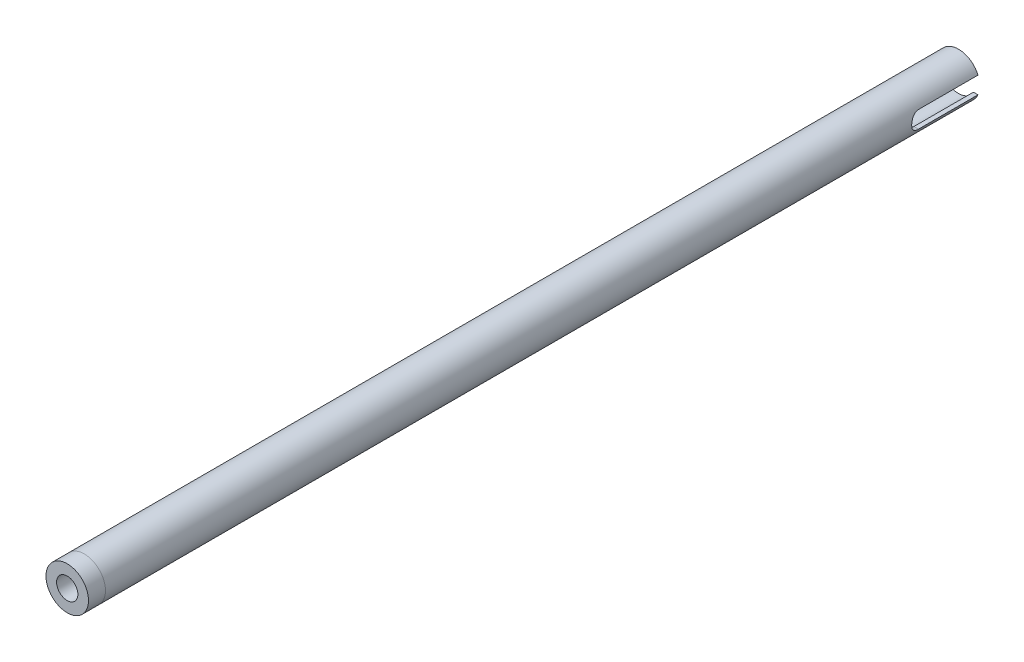
ISO-10303-21;
HEADER;
FILE_DESCRIPTION(('STEP AP214'),'2;1');
FILE_NAME('part.step','',(''),(''),'','','');
FILE_SCHEMA(('AUTOMOTIVE_DESIGN { 1 0 10303 214 1 1 1 1 }'));
ENDSEC;
DATA;
#1=APPLICATION_CONTEXT('core data for automotive mechanical design processes');
#2=APPLICATION_PROTOCOL_DEFINITION('international standard','automotive_design',2000,#1);
#3=PRODUCT_CONTEXT('',#1,'mechanical');
#4=PRODUCT('Part','Part','',(#3));
#5=PRODUCT_RELATED_PRODUCT_CATEGORY('part','',(#4));
#6=PRODUCT_DEFINITION_FORMATION('','',#4);
#7=PRODUCT_DEFINITION_CONTEXT('part definition',#1,'design');
#8=PRODUCT_DEFINITION('design','',#6,#7);
#9=PRODUCT_DEFINITION_SHAPE('','',#8);
#10=(LENGTH_UNIT() NAMED_UNIT(*) SI_UNIT(.MILLI.,.METRE.));
#11=(NAMED_UNIT(*) PLANE_ANGLE_UNIT() SI_UNIT($,.RADIAN.));
#12=(NAMED_UNIT(*) SI_UNIT($,.STERADIAN.) SOLID_ANGLE_UNIT());
#13=UNCERTAINTY_MEASURE_WITH_UNIT(LENGTH_MEASURE(1.E-05),#10,'distance_accuracy_value','');
#14=(GEOMETRIC_REPRESENTATION_CONTEXT(3) GLOBAL_UNCERTAINTY_ASSIGNED_CONTEXT((#13)) GLOBAL_UNIT_ASSIGNED_CONTEXT((#10,
#11,#12)) REPRESENTATION_CONTEXT('',''));
#15=CARTESIAN_POINT('',(0.,0.,0.));
#16=DIRECTION('',(0.,0.,1.));
#17=DIRECTION('',(1.,0.,0.));
#18=AXIS2_PLACEMENT_3D('',#15,#16,#17);
#19=CARTESIAN_POINT('',(0.,0.,-332.656225434528));
#20=DIRECTION('',(0.,0.,1.));
#21=DIRECTION('',(1.,0.,0.));
#22=AXIS2_PLACEMENT_3D('',#19,#20,#21);
#23=CYLINDRICAL_SURFACE('',#22,7.9375);
#24=CARTESIAN_POINT('',(0.,0.,-6.35));
#25=DIRECTION('',(0.,0.,1.));
#26=DIRECTION('',(1.,0.,0.));
#27=AXIS2_PLACEMENT_3D('',#24,#25,#26);
#28=CIRCLE('',#27,7.9375);
#29=CARTESIAN_POINT('',(7.9375,0.,-6.35));
#30=VERTEX_POINT('',#29);
#31=EDGE_CURVE('E167',#30,#30,#28,.T.);
#32=ORIENTED_EDGE('',*,*,#31,.F.);
#33=EDGE_LOOP('',(#32));
#34=FACE_BOUND('',#33,.T.);
#35=CARTESIAN_POINT('',(-7.2748389157424,3.175,-310.431225434528));
#36=CARTESIAN_POINT('',(-7.27482137043434,3.17501267173453,-310.345805319045));
#37=CARTESIAN_POINT('',(-7.27634297592672,3.17155313247793,-310.260394789483));
#38=CARTESIAN_POINT('',(-7.28233338484875,3.15778866907725,-310.090262785155));
#39=CARTESIAN_POINT('',(-7.28680106535325,3.14748635311323,-310.005541060296));
#40=CARTESIAN_POINT('',(-7.2985291631267,3.12019002880163,-309.837727360487));
#41=CARTESIAN_POINT('',(-7.30577831906487,3.10322299732752,-309.754630215728));
#42=CARTESIAN_POINT('',(-7.32282161153744,3.06278779397035,-309.590319113702));
#43=CARTESIAN_POINT('',(-7.33261590324725,3.03931922568674,-309.509105271589));
#44=CARTESIAN_POINT('',(-7.36535331460444,2.95952924342962,-309.269280449006));
#45=CARTESIAN_POINT('',(-7.39167595677839,2.89376893609239,-309.114155520202));
#46=CARTESIAN_POINT('',(-7.45033259991547,2.73920602658923,-308.817068093491));
#47=CARTESIAN_POINT('',(-7.48267254395243,2.65038060922872,-308.675118818273));
#48=CARTESIAN_POINT('',(-7.55175295441386,2.44684429809695,-308.400398048754));
#49=CARTESIAN_POINT('',(-7.58863404630154,2.33103943595689,-308.268470664242));
#50=CARTESIAN_POINT('',(-7.66147718953598,2.07914562663536,-308.02530778061));
#51=CARTESIAN_POINT('',(-7.69743902899202,1.94305205135848,-307.914077015682));
#52=CARTESIAN_POINT('',(-7.76611692840651,1.64778282664419,-307.711155816187));
#53=CARTESIAN_POINT('',(-7.79864638434712,1.48790317306356,-307.620421404783));
#54=CARTESIAN_POINT('',(-7.85502980346525,1.15369615984563,-307.467563851366));
#55=CARTESIAN_POINT('',(-7.87889360585224,0.979385463602722,-307.405408238748));
#56=CARTESIAN_POINT('',(-7.91022225039827,0.670405323433354,-307.324896595092));
#57=CARTESIAN_POINT('',(-7.92038443902171,0.537888188660439,-307.299218671683));
#58=CARTESIAN_POINT('',(-7.93061686811603,0.337231082382107,-307.273463588601));
#59=CARTESIAN_POINT('',(-7.93319257341971,0.269991647180298,-307.267005491321));
#60=CARTESIAN_POINT('',(-7.93663621925193,0.135173873369596,-307.258384473569));
#61=CARTESIAN_POINT('',(-7.93750363389236,0.0675954368175869,-307.25622287575));
#62=CARTESIAN_POINT('',(-7.9375,0.,-307.256225434528));
#63=B_SPLINE_CURVE_WITH_KNOTS('',3,(#35,#36,#37,#38,#39,#40,#41,#42,#43,#44,#45,#46,#47,#48,#49,
#50,#51,#52,#53,#54,#55,#56,#57,#58,#59,#60,#61,#62),.UNSPECIFIED.,.F.,.F.,(4,2,2,2,2,2,2,2,2,2,
2,2,2,4),(0.,0.256160797396612,0.512224013007058,0.767261264672238,1.02231406945471,
1.53142416248594,2.04103978047897,2.57679273649398,3.11266809162683,3.66991136029742,
4.22651992730645,4.63134321412666,4.8339937586662,5.03670667834028),.UNSPECIFIED.);
#64=CARTESIAN_POINT('',(-7.2748389157424,3.175,-310.431225434528));
#65=VERTEX_POINT('',#64);
#66=CARTESIAN_POINT('',(-7.9375,0.,-307.256225434528));
#67=VERTEX_POINT('',#66);
#68=EDGE_CURVE('E194',#65,#67,#63,.T.);
#69=ORIENTED_EDGE('',*,*,#68,.T.);
#70=CARTESIAN_POINT('',(-7.9375,0.,-307.256225434528));
#71=CARTESIAN_POINT('',(-7.93751279435796,-0.0856973243893185,-307.256213404359));
#72=CARTESIAN_POINT('',(-7.93611246860092,-0.171386675169291,-307.259694771831));
#73=CARTESIAN_POINT('',(-7.93058107051394,-0.342092796869088,-307.273550867165));
#74=CARTESIAN_POINT('',(-7.92645080745519,-0.427109759557717,-307.283923552148));
#75=CARTESIAN_POINT('',(-7.91557399086504,-0.595570690948319,-307.311420746216));
#76=CARTESIAN_POINT('',(-7.90883664469869,-0.67901912358001,-307.328521497489));
#77=CARTESIAN_POINT('',(-7.89293284658536,-0.844038966454646,-307.369288744962));
#78=CARTESIAN_POINT('',(-7.88376629739099,-0.925610301410303,-307.392955504019));
#79=CARTESIAN_POINT('',(-7.85297007832481,-1.16656173687588,-307.473463159718));
#80=CARTESIAN_POINT('',(-7.82802544143958,-1.32244720282989,-307.539855792595));
#81=CARTESIAN_POINT('',(-7.77174407779742,-1.62081902572888,-307.695901196588));
#82=CARTESIAN_POINT('',(-7.74040257287306,-1.7632952496653,-307.785571368651));
#83=CARTESIAN_POINT('',(-7.67287736621953,-2.03755465224644,-307.990024976166));
#84=CARTESIAN_POINT('',(-7.63654472176442,-2.16862853615059,-308.105711832898));
#85=CARTESIAN_POINT('',(-7.56380976030912,-2.41011022612819,-308.357005934607));
#86=CARTESIAN_POINT('',(-7.52740741976911,-2.52050895891189,-308.492621879089));
#87=CARTESIAN_POINT('',(-7.45683282624284,-2.72240939900242,-308.787320373955));
#88=CARTESIAN_POINT('',(-7.4228346735038,-2.81283701743189,-308.947184363871));
#89=CARTESIAN_POINT('',(-7.3633362219632,-2.96511894168388,-309.281310328667));
#90=CARTESIAN_POINT('',(-7.33782422493328,-3.02701262758154,-309.455552066426));
#91=CARTESIAN_POINT('',(-7.30424985403508,-3.10695047193342,-309.763855791078));
#92=CARTESIAN_POINT('',(-7.29331360019113,-3.13238569878909,-309.895714551964));
#93=CARTESIAN_POINT('',(-7.28227977674291,-3.15790858319001,-310.095431433658));
#94=CARTESIAN_POINT('',(-7.27949685702346,-3.16431127275807,-310.162379724417));
#95=CARTESIAN_POINT('',(-7.27577355567174,-3.17285909036155,-310.296621282284));
#96=CARTESIAN_POINT('',(-7.27483380475762,-3.1750027609968,-310.363914659581));
#97=CARTESIAN_POINT('',(-7.2748389157424,-3.175,-310.431225434528));
#98=B_SPLINE_CURVE_WITH_KNOTS('',3,(#70,#71,#72,#73,#74,#75,#76,#77,#78,#79,#80,#81,#82,#83,#84,
#85,#86,#87,#88,#89,#90,#91,#92,#93,#94,#95,#96,#97),.UNSPECIFIED.,.F.,.F.,(4,2,2,2,2,2,2,2,2,2,
2,2,2,4),(0.,0.256996432008007,0.513916713336978,0.769937797705386,1.02596913282157,
1.53722547809954,2.04886511530059,2.58219314099272,3.11575467201799,3.67332953074261,
4.2301325519037,4.63306130520181,4.8348500382744,5.03670780985612),.UNSPECIFIED.);
#99=CARTESIAN_POINT('',(-7.2748389157424,-3.175,-310.431225434528));
#100=VERTEX_POINT('',#99);
#101=EDGE_CURVE('E146',#67,#100,#98,.T.);
#102=ORIENTED_EDGE('',*,*,#101,.T.);
#103=DIRECTION('',(0.,0.,-1.));
#104=VECTOR('',#103,1.);
#105=CARTESIAN_POINT('',(-7.2748389157424,-3.175,-307.256225434528));
#106=LINE('',#105,#104);
#107=CARTESIAN_POINT('',(-7.2748389157424,-3.175,-332.656225434528));
#108=VERTEX_POINT('',#107);
#109=EDGE_CURVE('E141',#100,#108,#106,.T.);
#110=ORIENTED_EDGE('',*,*,#109,.T.);
#111=CARTESIAN_POINT('',(0.,0.,-332.656225434528));
#112=DIRECTION('',(0.,0.,1.));
#113=DIRECTION('',(1.,0.,0.));
#114=AXIS2_PLACEMENT_3D('',#111,#112,#113);
#115=CIRCLE('',#114,7.9375);
#116=CARTESIAN_POINT('',(7.2748389157424,-3.175,-332.656225434528));
#117=VERTEX_POINT('',#116);
#118=EDGE_CURVE('E144',#108,#117,#115,.T.);
#119=ORIENTED_EDGE('',*,*,#118,.T.);
#120=DIRECTION('',(0.,0.,-1.));
#121=VECTOR('',#120,1.);
#122=CARTESIAN_POINT('',(7.2748389157424,-3.175,-307.256225434528));
#123=LINE('',#122,#121);
#124=CARTESIAN_POINT('',(7.2748389157424,-3.175,-310.431225434528));
#125=VERTEX_POINT('',#124);
#126=EDGE_CURVE('E427',#125,#117,#123,.T.);
#127=ORIENTED_EDGE('',*,*,#126,.F.);
#128=CARTESIAN_POINT('',(7.2748389157424,-3.175,-310.431225434528));
#129=CARTESIAN_POINT('',(7.27482137043434,-3.17501267173453,-310.345805319045));
#130=CARTESIAN_POINT('',(7.27634297592672,-3.17155313247793,-310.260394789483));
#131=CARTESIAN_POINT('',(7.28233338484875,-3.15778866907725,-310.090262785155));
#132=CARTESIAN_POINT('',(7.28680106535325,-3.14748635311323,-310.005541060296));
#133=CARTESIAN_POINT('',(7.2985291631267,-3.12019002880163,-309.837727360487));
#134=CARTESIAN_POINT('',(7.30577831906487,-3.10322299732752,-309.754630215728));
#135=CARTESIAN_POINT('',(7.32282161153744,-3.06278779397035,-309.590319113702));
#136=CARTESIAN_POINT('',(7.33261590324725,-3.03931922568674,-309.509105271589));
#137=CARTESIAN_POINT('',(7.36535331460444,-2.95952924342962,-309.269280449006));
#138=CARTESIAN_POINT('',(7.39167595677839,-2.89376893609239,-309.114155520202));
#139=CARTESIAN_POINT('',(7.45033259991547,-2.73920602658923,-308.817068093491));
#140=CARTESIAN_POINT('',(7.48267254395243,-2.65038060922872,-308.675118818273));
#141=CARTESIAN_POINT('',(7.55175295441386,-2.44684429809695,-308.400398048754));
#142=CARTESIAN_POINT('',(7.58863404630154,-2.33103943595689,-308.268470664242));
#143=CARTESIAN_POINT('',(7.66147718953598,-2.07914562663536,-308.02530778061));
#144=CARTESIAN_POINT('',(7.69743902899202,-1.94305205135848,-307.914077015682));
#145=CARTESIAN_POINT('',(7.76611692840651,-1.64778282664419,-307.711155816187));
#146=CARTESIAN_POINT('',(7.79864638434712,-1.48790317306356,-307.620421404783));
#147=CARTESIAN_POINT('',(7.85502980346525,-1.15369615984563,-307.467563851366));
#148=CARTESIAN_POINT('',(7.87889360585224,-0.979385463602722,-307.405408238748));
#149=CARTESIAN_POINT('',(7.91022225039827,-0.670405323433354,-307.324896595092));
#150=CARTESIAN_POINT('',(7.92038443902171,-0.537888188660439,-307.299218671683));
#151=CARTESIAN_POINT('',(7.93061686811603,-0.337231082382107,-307.273463588601));
#152=CARTESIAN_POINT('',(7.93319257341971,-0.269991647180298,-307.267005491321));
#153=CARTESIAN_POINT('',(7.93663621925193,-0.135173873369596,-307.258384473569));
#154=CARTESIAN_POINT('',(7.93750363389236,-0.0675954368175869,-307.25622287575));
#155=CARTESIAN_POINT('',(7.9375,0.,-307.256225434528));
#156=B_SPLINE_CURVE_WITH_KNOTS('',3,(#128,#129,#130,#131,#132,#133,#134,#135,#136,#137,#138,
#139,#140,#141,#142,#143,#144,#145,#146,#147,#148,#149,#150,#151,#152,#153,#154,#155),
.UNSPECIFIED.,.F.,.F.,(4,2,2,2,2,2,2,2,2,2,2,2,2,4),(0.,0.256160797396612,0.512224013007058,
0.767261264672238,1.02231406945471,1.53142416248594,2.04103978047897,2.57679273649398,
3.11266809162683,3.66991136029742,4.22651992730645,4.63134321412666,4.8339937586662,
5.03670667834028),.UNSPECIFIED.);
#157=CARTESIAN_POINT('',(7.9375,0.,-307.256225434528));
#158=VERTEX_POINT('',#157);
#159=EDGE_CURVE('E87',#125,#158,#156,.T.);
#160=ORIENTED_EDGE('',*,*,#159,.T.);
#161=CARTESIAN_POINT('',(7.9375,0.,-307.256225434528));
#162=CARTESIAN_POINT('',(7.93751279435796,0.0856973243893185,-307.256213404359));
#163=CARTESIAN_POINT('',(7.93611246860092,0.171386675169291,-307.259694771831));
#164=CARTESIAN_POINT('',(7.93058107051394,0.342092796869088,-307.273550867165));
#165=CARTESIAN_POINT('',(7.92645080745519,0.427109759557717,-307.283923552148));
#166=CARTESIAN_POINT('',(7.91557399086504,0.595570690948319,-307.311420746216));
#167=CARTESIAN_POINT('',(7.90883664469869,0.67901912358001,-307.328521497489));
#168=CARTESIAN_POINT('',(7.89293284658536,0.844038966454646,-307.369288744962));
#169=CARTESIAN_POINT('',(7.88376629739099,0.925610301410303,-307.392955504019));
#170=CARTESIAN_POINT('',(7.85297007832481,1.16656173687588,-307.473463159718));
#171=CARTESIAN_POINT('',(7.82802544143958,1.32244720282989,-307.539855792595));
#172=CARTESIAN_POINT('',(7.77174407779742,1.62081902572888,-307.695901196588));
#173=CARTESIAN_POINT('',(7.74040257287306,1.7632952496653,-307.785571368651));
#174=CARTESIAN_POINT('',(7.67287736621953,2.03755465224644,-307.990024976166));
#175=CARTESIAN_POINT('',(7.63654472176442,2.16862853615059,-308.105711832898));
#176=CARTESIAN_POINT('',(7.56380976030912,2.41011022612819,-308.357005934607));
#177=CARTESIAN_POINT('',(7.52740741976911,2.52050895891189,-308.492621879089));
#178=CARTESIAN_POINT('',(7.45683282624284,2.72240939900242,-308.787320373955));
#179=CARTESIAN_POINT('',(7.4228346735038,2.81283701743189,-308.947184363871));
#180=CARTESIAN_POINT('',(7.3633362219632,2.96511894168388,-309.281310328667));
#181=CARTESIAN_POINT('',(7.33782422493328,3.02701262758154,-309.455552066426));
#182=CARTESIAN_POINT('',(7.30424985403508,3.10695047193342,-309.763855791078));
#183=CARTESIAN_POINT('',(7.29331360019113,3.13238569878909,-309.895714551964));
#184=CARTESIAN_POINT('',(7.28227977674291,3.15790858319001,-310.095431433658));
#185=CARTESIAN_POINT('',(7.27949685702346,3.16431127275807,-310.162379724417));
#186=CARTESIAN_POINT('',(7.27577355567174,3.17285909036155,-310.296621282284));
#187=CARTESIAN_POINT('',(7.27483380475762,3.1750027609968,-310.363914659581));
#188=CARTESIAN_POINT('',(7.2748389157424,3.175,-310.431225434528));
#189=B_SPLINE_CURVE_WITH_KNOTS('',3,(#161,#162,#163,#164,#165,#166,#167,#168,#169,#170,#171,
#172,#173,#174,#175,#176,#177,#178,#179,#180,#181,#182,#183,#184,#185,#186,#187,#188),
.UNSPECIFIED.,.F.,.F.,(4,2,2,2,2,2,2,2,2,2,2,2,2,4),(0.,0.256996432008007,0.513916713336978,
0.769937797705386,1.02596913282157,1.53722547809954,2.04886511530059,2.58219314099272,
3.11575467201799,3.67332953074261,4.2301325519037,4.63306130520181,4.8348500382744,
5.03670780985612),.UNSPECIFIED.);
#190=CARTESIAN_POINT('',(7.2748389157424,3.175,-310.431225434528));
#191=VERTEX_POINT('',#190);
#192=EDGE_CURVE('E73',#158,#191,#189,.T.);
#193=ORIENTED_EDGE('',*,*,#192,.T.);
#194=DIRECTION('',(0.,0.,-1.));
#195=VECTOR('',#194,1.);
#196=CARTESIAN_POINT('',(7.2748389157424,3.175,-307.256225434528));
#197=LINE('',#196,#195);
#198=CARTESIAN_POINT('',(7.2748389157424,3.175,-332.656225434528));
#199=VERTEX_POINT('',#198);
#200=EDGE_CURVE('E160',#191,#199,#197,.T.);
#201=ORIENTED_EDGE('',*,*,#200,.T.);
#202=CARTESIAN_POINT('',(-7.2748389157424,3.175,-332.656225434528));
#203=VERTEX_POINT('',#202);
#204=EDGE_CURVE('E166',#199,#203,#115,.T.);
#205=ORIENTED_EDGE('',*,*,#204,.T.);
#206=DIRECTION('',(0.,0.,-1.));
#207=VECTOR('',#206,1.);
#208=CARTESIAN_POINT('',(-7.2748389157424,3.175,-307.256225434528));
#209=LINE('',#208,#207);
#210=EDGE_CURVE('E420',#65,#203,#209,.T.);
#211=ORIENTED_EDGE('',*,*,#210,.F.);
#212=EDGE_LOOP('',(#69,#102,#110,#119,#127,#160,#193,#201,#205,#211));
#213=FACE_BOUND('',#212,.T.);
#214=ADVANCED_FACE('F63',(#34,#213),#23,.T.);
#215=CARTESIAN_POINT('',(0.,0.,-332.656225434528));
#216=DIRECTION('',(0.,0.,1.));
#217=DIRECTION('',(1.,0.,0.));
#218=AXIS2_PLACEMENT_3D('',#215,#216,#217);
#219=PLANE('',#218);
#220=DIRECTION('',(1.,0.,0.));
#221=VECTOR('',#220,1.);
#222=CARTESIAN_POINT('',(0.,-3.175,-332.656225434528));
#223=LINE('',#222,#221);
#224=CARTESIAN_POINT('',(-5.57246419907746,-3.175,-332.656225434528));
#225=VERTEX_POINT('',#224);
#226=EDGE_CURVE('E153',#108,#225,#223,.T.);
#227=ORIENTED_EDGE('',*,*,#226,.T.);
#228=CARTESIAN_POINT('',(0.,0.,-332.656225434528));
#229=DIRECTION('',(0.,0.,1.));
#230=DIRECTION('',(1.,0.,0.));
#231=AXIS2_PLACEMENT_3D('',#228,#229,#230);
#232=CIRCLE('',#231,6.4135);
#233=CARTESIAN_POINT('',(5.57246419907746,-3.175,-332.656225434528));
#234=VERTEX_POINT('',#233);
#235=EDGE_CURVE('E275',#225,#234,#232,.T.);
#236=ORIENTED_EDGE('',*,*,#235,.T.);
#237=DIRECTION('',(1.,0.,0.));
#238=VECTOR('',#237,1.);
#239=CARTESIAN_POINT('',(0.,-3.175,-332.656225434528));
#240=LINE('',#239,#238);
#241=EDGE_CURVE('E165',#234,#117,#240,.T.);
#242=ORIENTED_EDGE('',*,*,#241,.T.);
#243=ORIENTED_EDGE('',*,*,#118,.F.);
#244=EDGE_LOOP('',(#227,#236,#242,#243));
#245=FACE_BOUND('',#244,.T.);
#246=ADVANCED_FACE('F163',(#245),#219,.F.);
#247=CARTESIAN_POINT('',(0.,0.,-332.656225434528));
#248=DIRECTION('',(0.,0.,1.));
#249=DIRECTION('',(1.,0.,0.));
#250=AXIS2_PLACEMENT_3D('',#247,#248,#249);
#251=CYLINDRICAL_SURFACE('',#250,6.4135);
#252=CARTESIAN_POINT('',(0.,0.,-6.35));
#253=DIRECTION('',(0.,0.,1.));
#254=DIRECTION('',(1.,0.,0.));
#255=AXIS2_PLACEMENT_3D('',#252,#253,#254);
#256=CIRCLE('',#255,6.4135);
#257=CARTESIAN_POINT('',(6.4135,0.,-6.35));
#258=VERTEX_POINT('',#257);
#259=EDGE_CURVE('E149',#258,#258,#256,.T.);
#260=ORIENTED_EDGE('',*,*,#259,.T.);
#261=EDGE_LOOP('',(#260));
#262=FACE_BOUND('',#261,.T.);
#263=DIRECTION('',(0.,0.,-1.));
#264=VECTOR('',#263,1.);
#265=CARTESIAN_POINT('',(-5.57246419907746,-3.175,-307.256225434528));
#266=LINE('',#265,#264);
#267=CARTESIAN_POINT('',(-5.57246419907746,-3.175,-310.431225434528));
#268=VERTEX_POINT('',#267);
#269=EDGE_CURVE('E150',#268,#225,#266,.T.);
#270=ORIENTED_EDGE('',*,*,#269,.F.);
#271=CARTESIAN_POINT('',(-5.57246419907746,-3.175,-310.431225434528));
#272=CARTESIAN_POINT('',(-5.57244013006406,-3.17501485930532,-310.347946321489));
#273=CARTESIAN_POINT('',(-5.57433046393327,-3.17172393593588,-310.264680554619));
#274=CARTESIAN_POINT('',(-5.58175879139227,-3.15864741746939,-310.098872969807));
#275=CARTESIAN_POINT('',(-5.58729459414879,-3.14886572313217,-310.016330747206));
#276=CARTESIAN_POINT('',(-5.60179156831922,-3.12299843383605,-309.853033940477));
#277=CARTESIAN_POINT('',(-5.61073298145,-3.10694918790095,-309.772271835563));
#278=CARTESIAN_POINT('',(-5.63171276239417,-3.06875665913499,-309.612627920062));
#279=CARTESIAN_POINT('',(-5.64375147558632,-3.04661269666535,-309.533746320242));
#280=CARTESIAN_POINT('',(-5.6838799338154,-2.97148657354666,-309.301013145243));
#281=CARTESIAN_POINT('',(-5.71602843451584,-2.90973243042152,-309.150592648005));
#282=CARTESIAN_POINT('',(-5.78746445334561,-2.76491119647661,-308.862135431177));
#283=CARTESIAN_POINT('',(-5.8267630725243,-2.68181088046089,-308.724118473811));
#284=CARTESIAN_POINT('',(-5.91189137020974,-2.48887418737119,-308.452321389782));
#285=CARTESIAN_POINT('',(-5.95799203211627,-2.37743022169016,-308.319764587331));
#286=CARTESIAN_POINT('',(-6.04933625068999,-2.13433179626949,-308.074296918258));
#287=CARTESIAN_POINT('',(-6.09457954365871,-2.00267122837297,-307.961392011245));
#288=CARTESIAN_POINT('',(-6.18270630442022,-1.71220053093684,-307.751072718793));
#289=CARTESIAN_POINT('',(-6.22523407848511,-1.55216870534977,-307.655182968362));
#290=CARTESIAN_POINT('',(-6.29953728626817,-1.21586879246633,-307.492334072045));
#291=CARTESIAN_POINT('',(-6.33132906884324,-1.03962591706377,-307.425330894002));
#292=CARTESIAN_POINT('',(-6.37455801221378,-0.719418942476251,-307.335459061671));
#293=CARTESIAN_POINT('',(-6.38903678436651,-0.577736145507957,-307.305886347307));
#294=CARTESIAN_POINT('',(-6.40364692368403,-0.362616983152034,-307.276165272992));
#295=CARTESIAN_POINT('',(-6.40733246196224,-0.290370591494075,-307.268697760355));
#296=CARTESIAN_POINT('',(-6.41226237468065,-0.145424356491903,-307.258724871417));
#297=CARTESIAN_POINT('',(-6.41350576158006,-0.0727243416303698,-307.25622150248));
#298=CARTESIAN_POINT('',(-6.4135,0.,-307.256225434528));
#299=B_SPLINE_CURVE_WITH_KNOTS('',3,(#271,#272,#273,#274,#275,#276,#277,#278,#279,#280,#281,
#282,#283,#284,#285,#286,#287,#288,#289,#290,#291,#292,#293,#294,#295,#296,#297,#298),
.UNSPECIFIED.,.F.,.F.,(4,2,2,2,2,2,2,2,2,2,2,2,2,4),(0.,0.249729002226608,0.499308060527582,
0.747460667546715,0.995640957972498,1.49055300136654,1.98624009021394,2.52160227908797,
3.05712653941521,3.62817923327589,4.19835836008502,4.63305000595099,4.85103401853339,
5.06910615989469),.UNSPECIFIED.);
#300=CARTESIAN_POINT('',(-6.4135,0.,-307.256225434528));
#301=VERTEX_POINT('',#300);
#302=EDGE_CURVE('E221',#268,#301,#299,.T.);
#303=ORIENTED_EDGE('',*,*,#302,.T.);
#304=CARTESIAN_POINT('',(-6.4135,0.,-307.256225434528));
#305=CARTESIAN_POINT('',(-6.41351478956105,0.0839162873638195,-307.256212034632));
#306=CARTESIAN_POINT('',(-6.41185341043851,0.167823114288182,-307.259551960679));
#307=CARTESIAN_POINT('',(-6.40528923860734,0.33495253632637,-307.272834401284));
#308=CARTESIAN_POINT('',(-6.40038773102953,0.418175389480093,-307.282774298105));
#309=CARTESIAN_POINT('',(-6.38748331817869,0.58296549878522,-307.309093102623));
#310=CARTESIAN_POINT('',(-6.37949454331383,0.664538541389253,-307.325442678111));
#311=CARTESIAN_POINT('',(-6.36062930478242,0.825821595252368,-307.364380981704));
#312=CARTESIAN_POINT('',(-6.34975266552956,0.905531492908811,-307.386970089185));
#313=CARTESIAN_POINT('',(-6.31319792977548,1.14087800407252,-307.463706651945));
#314=CARTESIAN_POINT('',(-6.28356695572383,1.29306927815055,-307.526878300133));
#315=CARTESIAN_POINT('',(-6.21648032622801,1.58455945770353,-307.675029042113));
#316=CARTESIAN_POINT('',(-6.17901685649499,1.72384528592309,-307.760029933892));
#317=CARTESIAN_POINT('',(-6.09713913910647,1.99475482128856,-307.955130072143));
#318=CARTESIAN_POINT('',(-6.05244508581476,2.12544046453043,-308.066414948882));
#319=CARTESIAN_POINT('',(-5.96206469267669,2.36716277188881,-308.308384395047));
#320=CARTESIAN_POINT('',(-5.9163776032387,2.47818397002904,-308.439084086887));
#321=CARTESIAN_POINT('',(-5.82517699615972,2.68591268931947,-308.728129915839));
#322=CARTESIAN_POINT('',(-5.77994318763785,2.78087960507694,-308.887825110419));
#323=CARTESIAN_POINT('',(-5.69959190124919,2.9420744279085,-309.2232083876));
#324=CARTESIAN_POINT('',(-5.66445328320705,3.00836254036259,-309.398862020772));
#325=CARTESIAN_POINT('',(-5.61637168534323,3.09697219420915,-309.717313395166));
#326=CARTESIAN_POINT('',(-5.60011055849822,3.1260622343607,-309.857727997826));
#327=CARTESIAN_POINT('',(-5.58363385282995,3.15533369889112,-310.071104876068));
#328=CARTESIAN_POINT('',(-5.57946041232981,3.16269716900745,-310.14283660095));
#329=CARTESIAN_POINT('',(-5.57386984218861,3.17253394278506,-310.286778540993));
#330=CARTESIAN_POINT('',(-5.57245416126573,3.17500467618403,-310.358988987664));
#331=CARTESIAN_POINT('',(-5.57246419907746,3.175,-310.431225434528));
#332=B_SPLINE_CURVE_WITH_KNOTS('',3,(#304,#305,#306,#307,#308,#309,#310,#311,#312,#313,#314,
#315,#316,#317,#318,#319,#320,#321,#322,#323,#324,#325,#326,#327,#328,#329,#330,#331),
.UNSPECIFIED.,.F.,.F.,(4,2,2,2,2,2,2,2,2,2,2,2,2,4),(0.,0.251650249697328,0.503200747298848,
0.75361328099314,1.00404104361821,1.50387930503274,2.00421864304453,2.53410176460237,
3.06439980342596,3.63519589642624,4.20478783377489,4.63602373673194,4.85251353275904,
5.06911702550462),.UNSPECIFIED.);
#333=CARTESIAN_POINT('',(-5.57246419907746,3.175,-310.431225434528));
#334=VERTEX_POINT('',#333);
#335=EDGE_CURVE('E186',#301,#334,#332,.T.);
#336=ORIENTED_EDGE('',*,*,#335,.T.);
#337=DIRECTION('',(0.,0.,-1.));
#338=VECTOR('',#337,1.);
#339=CARTESIAN_POINT('',(-5.57246419907746,3.175,-307.256225434528));
#340=LINE('',#339,#338);
#341=CARTESIAN_POINT('',(-5.57246419907746,3.175,-332.656225434528));
#342=VERTEX_POINT('',#341);
#343=EDGE_CURVE('E417',#334,#342,#340,.T.);
#344=ORIENTED_EDGE('',*,*,#343,.T.);
#345=CARTESIAN_POINT('',(5.57246419907746,3.175,-332.656225434528));
#346=VERTEX_POINT('',#345);
#347=EDGE_CURVE('E172',#346,#342,#232,.T.);
#348=ORIENTED_EDGE('',*,*,#347,.F.);
#349=DIRECTION('',(0.,0.,-1.));
#350=VECTOR('',#349,1.);
#351=CARTESIAN_POINT('',(5.57246419907746,3.175,-307.256225434528));
#352=LINE('',#351,#350);
#353=CARTESIAN_POINT('',(5.57246419907746,3.175,-310.431225434528));
#354=VERTEX_POINT('',#353);
#355=EDGE_CURVE('E269',#354,#346,#352,.T.);
#356=ORIENTED_EDGE('',*,*,#355,.F.);
#357=CARTESIAN_POINT('',(5.57246419907746,3.175,-310.431225434528));
#358=CARTESIAN_POINT('',(5.57244013006406,3.17501485930532,-310.347946321489));
#359=CARTESIAN_POINT('',(5.57433046393327,3.17172393593588,-310.264680554619));
#360=CARTESIAN_POINT('',(5.58175879139227,3.15864741746939,-310.098872969807));
#361=CARTESIAN_POINT('',(5.58729459414879,3.14886572313217,-310.016330747206));
#362=CARTESIAN_POINT('',(5.60179156831922,3.12299843383605,-309.853033940477));
#363=CARTESIAN_POINT('',(5.61073298145,3.10694918790095,-309.772271835563));
#364=CARTESIAN_POINT('',(5.63171276239417,3.06875665913499,-309.612627920062));
#365=CARTESIAN_POINT('',(5.64375147558632,3.04661269666535,-309.533746320242));
#366=CARTESIAN_POINT('',(5.6838799338154,2.97148657354666,-309.301013145243));
#367=CARTESIAN_POINT('',(5.71602843451584,2.90973243042152,-309.150592648005));
#368=CARTESIAN_POINT('',(5.78746445334561,2.76491119647661,-308.862135431177));
#369=CARTESIAN_POINT('',(5.8267630725243,2.68181088046089,-308.724118473811));
#370=CARTESIAN_POINT('',(5.91189137020974,2.48887418737119,-308.452321389782));
#371=CARTESIAN_POINT('',(5.95799203211627,2.37743022169016,-308.319764587331));
#372=CARTESIAN_POINT('',(6.04933625068999,2.13433179626949,-308.074296918258));
#373=CARTESIAN_POINT('',(6.09457954365871,2.00267122837297,-307.961392011245));
#374=CARTESIAN_POINT('',(6.18270630442022,1.71220053093684,-307.751072718793));
#375=CARTESIAN_POINT('',(6.22523407848511,1.55216870534977,-307.655182968362));
#376=CARTESIAN_POINT('',(6.29953728626817,1.21586879246633,-307.492334072045));
#377=CARTESIAN_POINT('',(6.33132906884324,1.03962591706377,-307.425330894002));
#378=CARTESIAN_POINT('',(6.37455801221378,0.719418942476251,-307.335459061671));
#379=CARTESIAN_POINT('',(6.38903678436651,0.577736145507957,-307.305886347307));
#380=CARTESIAN_POINT('',(6.40364692368403,0.362616983152034,-307.276165272992));
#381=CARTESIAN_POINT('',(6.40733246196224,0.290370591494075,-307.268697760355));
#382=CARTESIAN_POINT('',(6.41226237468065,0.145424356491903,-307.258724871417));
#383=CARTESIAN_POINT('',(6.41350576158006,0.0727243416303698,-307.25622150248));
#384=CARTESIAN_POINT('',(6.4135,0.,-307.256225434528));
#385=B_SPLINE_CURVE_WITH_KNOTS('',3,(#357,#358,#359,#360,#361,#362,#363,#364,#365,#366,#367,
#368,#369,#370,#371,#372,#373,#374,#375,#376,#377,#378,#379,#380,#381,#382,#383,#384),
.UNSPECIFIED.,.F.,.F.,(4,2,2,2,2,2,2,2,2,2,2,2,2,4),(0.,0.249729002226608,0.499308060527582,
0.747460667546715,0.995640957972498,1.49055300136654,1.98624009021394,2.52160227908797,
3.05712653941521,3.62817923327589,4.19835836008502,4.63305000595099,4.85103401853339,
5.06910615989469),.UNSPECIFIED.);
#386=CARTESIAN_POINT('',(6.4135,0.,-307.256225434528));
#387=VERTEX_POINT('',#386);
#388=EDGE_CURVE('E13',#354,#387,#385,.T.);
#389=ORIENTED_EDGE('',*,*,#388,.T.);
#390=CARTESIAN_POINT('',(6.4135,0.,-307.256225434528));
#391=CARTESIAN_POINT('',(6.41351478956105,-0.0839162873638195,-307.256212034632));
#392=CARTESIAN_POINT('',(6.41185341043851,-0.167823114288182,-307.259551960679));
#393=CARTESIAN_POINT('',(6.40528923860734,-0.33495253632637,-307.272834401284));
#394=CARTESIAN_POINT('',(6.40038773102953,-0.418175389480093,-307.282774298105));
#395=CARTESIAN_POINT('',(6.38748331817869,-0.58296549878522,-307.309093102623));
#396=CARTESIAN_POINT('',(6.37949454331383,-0.664538541389253,-307.325442678111));
#397=CARTESIAN_POINT('',(6.36062930478242,-0.825821595252368,-307.364380981704));
#398=CARTESIAN_POINT('',(6.34975266552956,-0.905531492908811,-307.386970089185));
#399=CARTESIAN_POINT('',(6.31319792977548,-1.14087800407252,-307.463706651945));
#400=CARTESIAN_POINT('',(6.28356695572383,-1.29306927815055,-307.526878300133));
#401=CARTESIAN_POINT('',(6.21648032622801,-1.58455945770353,-307.675029042113));
#402=CARTESIAN_POINT('',(6.17901685649499,-1.72384528592309,-307.760029933892));
#403=CARTESIAN_POINT('',(6.09713913910647,-1.99475482128856,-307.955130072143));
#404=CARTESIAN_POINT('',(6.05244508581476,-2.12544046453043,-308.066414948882));
#405=CARTESIAN_POINT('',(5.96206469267669,-2.36716277188881,-308.308384395047));
#406=CARTESIAN_POINT('',(5.9163776032387,-2.47818397002904,-308.439084086887));
#407=CARTESIAN_POINT('',(5.82517699615972,-2.68591268931947,-308.728129915839));
#408=CARTESIAN_POINT('',(5.77994318763785,-2.78087960507694,-308.887825110419));
#409=CARTESIAN_POINT('',(5.69959190124919,-2.9420744279085,-309.2232083876));
#410=CARTESIAN_POINT('',(5.66445328320705,-3.00836254036259,-309.398862020772));
#411=CARTESIAN_POINT('',(5.61637168534323,-3.09697219420915,-309.717313395166));
#412=CARTESIAN_POINT('',(5.60011055849822,-3.1260622343607,-309.857727997826));
#413=CARTESIAN_POINT('',(5.58363385282995,-3.15533369889112,-310.071104876068));
#414=CARTESIAN_POINT('',(5.57946041232981,-3.16269716900745,-310.14283660095));
#415=CARTESIAN_POINT('',(5.57386984218861,-3.17253394278506,-310.286778540993));
#416=CARTESIAN_POINT('',(5.57245416126573,-3.17500467618403,-310.358988987664));
#417=CARTESIAN_POINT('',(5.57246419907746,-3.175,-310.431225434528));
#418=B_SPLINE_CURVE_WITH_KNOTS('',3,(#390,#391,#392,#393,#394,#395,#396,#397,#398,#399,#400,
#401,#402,#403,#404,#405,#406,#407,#408,#409,#410,#411,#412,#413,#414,#415,#416,#417),
.UNSPECIFIED.,.F.,.F.,(4,2,2,2,2,2,2,2,2,2,2,2,2,4),(0.,0.251650249697328,0.503200747298848,
0.75361328099314,1.00404104361821,1.50387930503274,2.00421864304453,2.53410176460237,
3.06439980342596,3.63519589642624,4.20478783377489,4.63602373673194,4.85251353275904,
5.06911702550462),.UNSPECIFIED.);
#419=CARTESIAN_POINT('',(5.57246419907746,-3.175,-310.431225434528));
#420=VERTEX_POINT('',#419);
#421=EDGE_CURVE('E237',#387,#420,#418,.T.);
#422=ORIENTED_EDGE('',*,*,#421,.T.);
#423=DIRECTION('',(0.,0.,-1.));
#424=VECTOR('',#423,1.);
#425=CARTESIAN_POINT('',(5.57246419907746,-3.175,-307.256225434528));
#426=LINE('',#425,#424);
#427=EDGE_CURVE('E271',#420,#234,#426,.T.);
#428=ORIENTED_EDGE('',*,*,#427,.T.);
#429=ORIENTED_EDGE('',*,*,#235,.F.);
#430=EDGE_LOOP('',(#270,#303,#336,#344,#348,#356,#389,#422,#428,#429));
#431=FACE_BOUND('',#430,.T.);
#432=ADVANCED_FACE('F201',(#262,#431),#251,.F.);
#433=ORIENTED_EDGE('',*,*,#347,.T.);
#434=DIRECTION('',(1.,0.,0.));
#435=VECTOR('',#434,1.);
#436=CARTESIAN_POINT('',(0.,3.175,-332.656225434528));
#437=LINE('',#436,#435);
#438=EDGE_CURVE('E159',#203,#342,#437,.T.);
#439=ORIENTED_EDGE('',*,*,#438,.F.);
#440=ORIENTED_EDGE('',*,*,#204,.F.);
#441=DIRECTION('',(1.,0.,0.));
#442=VECTOR('',#441,1.);
#443=CARTESIAN_POINT('',(0.,3.175,-332.656225434528));
#444=LINE('',#443,#442);
#445=EDGE_CURVE('E253',#346,#199,#444,.T.);
#446=ORIENTED_EDGE('',*,*,#445,.F.);
#447=EDGE_LOOP('',(#433,#439,#440,#446));
#448=FACE_BOUND('',#447,.T.);
#449=ADVANCED_FACE('F286',(#448),#219,.F.);
#450=CARTESIAN_POINT('',(0.,0.,-6.35));
#451=DIRECTION('',(0.,0.,1.));
#452=DIRECTION('',(1.,0.,0.));
#453=AXIS2_PLACEMENT_3D('',#450,#451,#452);
#454=PLANE('',#453);
#455=ORIENTED_EDGE('',*,*,#259,.F.);
#456=EDGE_LOOP('',(#455));
#457=FACE_BOUND('',#456,.T.);
#458=ORIENTED_EDGE('',*,*,#31,.T.);
#459=EDGE_LOOP('',(#458));
#460=FACE_BOUND('',#459,.T.);
#461=ADVANCED_FACE('F283',(#457,#460),#454,.T.);
#462=CARTESIAN_POINT('',(0.,3.175,-307.256225434528));
#463=DIRECTION('',(0.,1.,0.));
#464=DIRECTION('',(0.,0.,1.));
#465=AXIS2_PLACEMENT_3D('',#462,#463,#464);
#466=PLANE('',#465);
#467=ORIENTED_EDGE('',*,*,#200,.F.);
#468=DIRECTION('',(1.,0.,0.));
#469=VECTOR('',#468,1.);
#470=CARTESIAN_POINT('',(5.57246419907746,3.175,-310.431225434528));
#471=LINE('',#470,#469);
#472=EDGE_CURVE('E184',#191,#354,#471,.F.);
#473=ORIENTED_EDGE('',*,*,#472,.T.);
#474=ORIENTED_EDGE('',*,*,#355,.T.);
#475=ORIENTED_EDGE('',*,*,#445,.T.);
#476=EDGE_LOOP('',(#467,#473,#474,#475));
#477=FACE_BOUND('',#476,.T.);
#478=ADVANCED_FACE('F266',(#477),#466,.F.);
#479=CARTESIAN_POINT('',(0.,-3.175,-307.256225434528));
#480=DIRECTION('',(0.,1.,0.));
#481=DIRECTION('',(0.,0.,1.));
#482=AXIS2_PLACEMENT_3D('',#479,#480,#481);
#483=PLANE('',#482);
#484=ORIENTED_EDGE('',*,*,#427,.F.);
#485=DIRECTION('',(1.,0.,0.));
#486=VECTOR('',#485,1.);
#487=CARTESIAN_POINT('',(0.,-3.175,-310.431225434528));
#488=LINE('',#487,#486);
#489=EDGE_CURVE('E181',#420,#125,#488,.T.);
#490=ORIENTED_EDGE('',*,*,#489,.T.);
#491=ORIENTED_EDGE('',*,*,#126,.T.);
#492=ORIENTED_EDGE('',*,*,#241,.F.);
#493=EDGE_LOOP('',(#484,#490,#491,#492));
#494=FACE_BOUND('',#493,.T.);
#495=ADVANCED_FACE('F361',(#494),#483,.T.);
#496=CARTESIAN_POINT('',(0.,-3.175,-307.256225434528));
#497=DIRECTION('',(0.,1.,0.));
#498=DIRECTION('',(0.,0.,1.));
#499=AXIS2_PLACEMENT_3D('',#496,#497,#498);
#500=PLANE('',#499);
#501=ORIENTED_EDGE('',*,*,#109,.F.);
#502=DIRECTION('',(1.,0.,0.));
#503=VECTOR('',#502,1.);
#504=CARTESIAN_POINT('',(0.,-3.175,-310.431225434528));
#505=LINE('',#504,#503);
#506=EDGE_CURVE('E179',#100,#268,#505,.T.);
#507=ORIENTED_EDGE('',*,*,#506,.T.);
#508=ORIENTED_EDGE('',*,*,#269,.T.);
#509=ORIENTED_EDGE('',*,*,#226,.F.);
#510=EDGE_LOOP('',(#501,#507,#508,#509));
#511=FACE_BOUND('',#510,.T.);
#512=ADVANCED_FACE('F154',(#511),#500,.T.);
#513=CARTESIAN_POINT('',(0.,3.175,-307.256225434528));
#514=DIRECTION('',(0.,1.,0.));
#515=DIRECTION('',(0.,0.,1.));
#516=AXIS2_PLACEMENT_3D('',#513,#514,#515);
#517=PLANE('',#516);
#518=ORIENTED_EDGE('',*,*,#343,.F.);
#519=DIRECTION('',(1.,0.,0.));
#520=VECTOR('',#519,1.);
#521=CARTESIAN_POINT('',(-7.2748389157424,3.175,-310.431225434528));
#522=LINE('',#521,#520);
#523=EDGE_CURVE('E170',#334,#65,#522,.F.);
#524=ORIENTED_EDGE('',*,*,#523,.T.);
#525=ORIENTED_EDGE('',*,*,#210,.T.);
#526=ORIENTED_EDGE('',*,*,#438,.T.);
#527=EDGE_LOOP('',(#518,#524,#525,#526));
#528=FACE_BOUND('',#527,.T.);
#529=ADVANCED_FACE('F216',(#528),#517,.F.);
#530=CARTESIAN_POINT('',(0.,0.,-310.431225434528));
#531=DIRECTION('',(1.,0.,0.));
#532=DIRECTION('',(0.,0.,-1.));
#533=AXIS2_PLACEMENT_3D('',#530,#531,#532);
#534=CYLINDRICAL_SURFACE('',#533,3.175);
#535=ORIENTED_EDGE('',*,*,#506,.F.);
#536=ORIENTED_EDGE('',*,*,#101,.F.);
#537=DIRECTION('',(1.,0.,0.));
#538=VECTOR('',#537,1.);
#539=CARTESIAN_POINT('',(0.,0.,-307.256225434528));
#540=LINE('',#539,#538);
#541=EDGE_CURVE('E251',#301,#67,#540,.F.);
#542=ORIENTED_EDGE('',*,*,#541,.F.);
#543=ORIENTED_EDGE('',*,*,#302,.F.);
#544=EDGE_LOOP('',(#535,#536,#542,#543));
#545=FACE_BOUND('',#544,.T.);
#546=ADVANCED_FACE('F209',(#545),#534,.F.);
#547=CARTESIAN_POINT('',(0.,0.,-310.431225434528));
#548=DIRECTION('',(-1.,0.,0.));
#549=DIRECTION('',(0.,0.,1.));
#550=AXIS2_PLACEMENT_3D('',#547,#548,#549);
#551=CYLINDRICAL_SURFACE('',#550,3.175);
#552=ORIENTED_EDGE('',*,*,#68,.F.);
#553=ORIENTED_EDGE('',*,*,#523,.F.);
#554=ORIENTED_EDGE('',*,*,#335,.F.);
#555=ORIENTED_EDGE('',*,*,#541,.T.);
#556=EDGE_LOOP('',(#552,#553,#554,#555));
#557=FACE_BOUND('',#556,.T.);
#558=ADVANCED_FACE('F205',(#557),#551,.F.);
#559=CARTESIAN_POINT('',(0.,0.,-310.431225434528));
#560=DIRECTION('',(-1.,0.,0.));
#561=DIRECTION('',(0.,0.,1.));
#562=AXIS2_PLACEMENT_3D('',#559,#560,#561);
#563=CYLINDRICAL_SURFACE('',#562,3.175);
#564=DIRECTION('',(1.,0.,0.));
#565=VECTOR('',#564,1.);
#566=CARTESIAN_POINT('',(7.2748389157424,0.,-307.256225434528));
#567=LINE('',#566,#565);
#568=EDGE_CURVE('E68',#387,#158,#567,.T.);
#569=ORIENTED_EDGE('',*,*,#568,.F.);
#570=ORIENTED_EDGE('',*,*,#388,.F.);
#571=ORIENTED_EDGE('',*,*,#472,.F.);
#572=ORIENTED_EDGE('',*,*,#192,.F.);
#573=EDGE_LOOP('',(#569,#570,#571,#572));
#574=FACE_BOUND('',#573,.T.);
#575=ADVANCED_FACE('F65',(#574),#563,.F.);
#576=CARTESIAN_POINT('',(0.,0.,-310.431225434528));
#577=DIRECTION('',(1.,0.,0.));
#578=DIRECTION('',(0.,0.,-1.));
#579=AXIS2_PLACEMENT_3D('',#576,#577,#578);
#580=CYLINDRICAL_SURFACE('',#579,3.175);
#581=ORIENTED_EDGE('',*,*,#421,.F.);
#582=ORIENTED_EDGE('',*,*,#568,.T.);
#583=ORIENTED_EDGE('',*,*,#159,.F.);
#584=ORIENTED_EDGE('',*,*,#489,.F.);
#585=EDGE_LOOP('',(#581,#582,#583,#584));
#586=FACE_BOUND('',#585,.T.);
#587=ADVANCED_FACE('F218',(#586),#580,.F.);
#588=CLOSED_SHELL('',(#214,#246,#432,#449,#461,#478,#495,#512,#529,#546,#558,#575,#587));
#589=MANIFOLD_SOLID_BREP('B2',#588);
#590=CARTESIAN_POINT('',(0.,0.,-6.35));
#591=DIRECTION('',(0.,0.,1.));
#592=DIRECTION('',(1.,0.,0.));
#593=AXIS2_PLACEMENT_3D('',#590,#591,#592);
#594=CYLINDRICAL_SURFACE('',#593,7.9375);
#595=CARTESIAN_POINT('',(0.,0.,-6.35));
#596=DIRECTION('',(0.,0.,1.));
#597=DIRECTION('',(1.,0.,0.));
#598=AXIS2_PLACEMENT_3D('',#595,#596,#597);
#599=CIRCLE('',#598,7.9375);
#600=CARTESIAN_POINT('',(7.9375,0.,-6.35));
#601=VERTEX_POINT('',#600);
#602=EDGE_CURVE('E62',#601,#601,#599,.T.);
#603=ORIENTED_EDGE('',*,*,#602,.T.);
#604=EDGE_LOOP('',(#603));
#605=FACE_BOUND('',#604,.T.);
#606=CARTESIAN_POINT('',(0.,0.,0.));
#607=DIRECTION('',(0.,0.,1.));
#608=DIRECTION('',(1.,0.,0.));
#609=AXIS2_PLACEMENT_3D('',#606,#607,#608);
#610=CIRCLE('',#609,7.9375);
#611=CARTESIAN_POINT('',(7.9375,0.,0.));
#612=VERTEX_POINT('',#611);
#613=EDGE_CURVE('E465',#612,#612,#610,.T.);
#614=ORIENTED_EDGE('',*,*,#613,.F.);
#615=EDGE_LOOP('',(#614));
#616=FACE_BOUND('',#615,.T.);
#617=ADVANCED_FACE('F454',(#605,#616),#594,.T.);
#618=CARTESIAN_POINT('',(0.,0.,-6.35));
#619=DIRECTION('',(0.,0.,1.));
#620=DIRECTION('',(1.,0.,0.));
#621=AXIS2_PLACEMENT_3D('',#618,#619,#620);
#622=CYLINDRICAL_SURFACE('',#621,3.96875);
#623=CARTESIAN_POINT('',(0.,0.,0.));
#624=DIRECTION('',(0.,0.,1.));
#625=DIRECTION('',(1.,0.,0.));
#626=AXIS2_PLACEMENT_3D('',#623,#624,#625);
#627=CIRCLE('',#626,3.96875);
#628=CARTESIAN_POINT('',(3.96875,0.,0.));
#629=VERTEX_POINT('',#628);
#630=EDGE_CURVE('E457',#629,#629,#627,.T.);
#631=ORIENTED_EDGE('',*,*,#630,.T.);
#632=EDGE_LOOP('',(#631));
#633=FACE_BOUND('',#632,.T.);
#634=CARTESIAN_POINT('',(0.,0.,-15.875));
#635=DIRECTION('',(0.,0.,1.));
#636=DIRECTION('',(1.,0.,0.));
#637=AXIS2_PLACEMENT_3D('',#634,#635,#636);
#638=CIRCLE('',#637,3.96875);
#639=CARTESIAN_POINT('',(3.96875,0.,-15.875));
#640=VERTEX_POINT('',#639);
#641=EDGE_CURVE('E477',#640,#640,#638,.T.);
#642=ORIENTED_EDGE('',*,*,#641,.F.);
#643=EDGE_LOOP('',(#642));
#644=FACE_BOUND('',#643,.T.);
#645=ADVANCED_FACE('F485',(#633,#644),#622,.F.);
#646=CARTESIAN_POINT('',(0.,0.,-6.35));
#647=DIRECTION('',(0.,0.,1.));
#648=DIRECTION('',(1.,0.,0.));
#649=AXIS2_PLACEMENT_3D('',#646,#647,#648);
#650=PLANE('',#649);
#651=CARTESIAN_POINT('',(0.,0.,-6.35));
#652=DIRECTION('',(0.,0.,1.));
#653=DIRECTION('',(1.,0.,0.));
#654=AXIS2_PLACEMENT_3D('',#651,#652,#653);
#655=CIRCLE('',#654,6.4135);
#656=CARTESIAN_POINT('',(6.4135,0.,-6.35));
#657=VERTEX_POINT('',#656);
#658=EDGE_CURVE('E467',#657,#657,#655,.T.);
#659=ORIENTED_EDGE('',*,*,#658,.T.);
#660=EDGE_LOOP('',(#659));
#661=FACE_BOUND('',#660,.T.);
#662=ORIENTED_EDGE('',*,*,#602,.F.);
#663=EDGE_LOOP('',(#662));
#664=FACE_BOUND('',#663,.T.);
#665=ADVANCED_FACE('F487',(#661,#664),#650,.F.);
#666=CARTESIAN_POINT('',(0.,0.,0.));
#667=DIRECTION('',(0.,0.,1.));
#668=DIRECTION('',(1.,0.,0.));
#669=AXIS2_PLACEMENT_3D('',#666,#667,#668);
#670=PLANE('',#669);
#671=ORIENTED_EDGE('',*,*,#613,.T.);
#672=EDGE_LOOP('',(#671));
#673=FACE_BOUND('',#672,.T.);
#674=ORIENTED_EDGE('',*,*,#630,.F.);
#675=EDGE_LOOP('',(#674));
#676=FACE_BOUND('',#675,.T.);
#677=ADVANCED_FACE('F493',(#673,#676),#670,.T.);
#678=CARTESIAN_POINT('',(0.,0.,-15.875));
#679=DIRECTION('',(0.,0.,1.));
#680=DIRECTION('',(1.,0.,0.));
#681=AXIS2_PLACEMENT_3D('',#678,#679,#680);
#682=CYLINDRICAL_SURFACE('',#681,6.4135);
#683=CARTESIAN_POINT('',(0.,0.,-15.875));
#684=DIRECTION('',(0.,0.,1.));
#685=DIRECTION('',(1.,0.,0.));
#686=AXIS2_PLACEMENT_3D('',#683,#684,#685);
#687=CIRCLE('',#686,6.4135);
#688=CARTESIAN_POINT('',(6.4135,0.,-15.875));
#689=VERTEX_POINT('',#688);
#690=EDGE_CURVE('E470',#689,#689,#687,.T.);
#691=CARTESIAN_POINT('',(6.4135,0.,-15.875));
#692=CARTESIAN_POINT('',(6.4135,0.,-15.77578125));
#693=CARTESIAN_POINT('',(6.4135,0.,-15.6765625));
#694=CARTESIAN_POINT('',(6.4135,0.,-15.478125));
#695=CARTESIAN_POINT('',(6.4135,0.,-15.37890625));
#696=CARTESIAN_POINT('',(6.4135,0.,-15.18046875));
#697=CARTESIAN_POINT('',(6.4135,0.,-15.08125));
#698=CARTESIAN_POINT('',(6.4135,0.,-14.8828125));
#699=CARTESIAN_POINT('',(6.4135,0.,-14.78359375));
#700=CARTESIAN_POINT('',(6.4135,0.,-14.58515625));
#701=CARTESIAN_POINT('',(6.4135,0.,-14.4859375));
#702=CARTESIAN_POINT('',(6.4135,0.,-14.2875));
#703=CARTESIAN_POINT('',(6.4135,0.,-14.18828125));
#704=CARTESIAN_POINT('',(6.4135,0.,-13.98984375));
#705=CARTESIAN_POINT('',(6.4135,0.,-13.890625));
#706=CARTESIAN_POINT('',(6.4135,0.,-13.6921875));
#707=CARTESIAN_POINT('',(6.4135,0.,-13.59296875));
#708=CARTESIAN_POINT('',(6.4135,0.,-13.39453125));
#709=CARTESIAN_POINT('',(6.4135,0.,-13.2953125));
#710=CARTESIAN_POINT('',(6.4135,0.,-13.096875));
#711=CARTESIAN_POINT('',(6.4135,0.,-12.99765625));
#712=CARTESIAN_POINT('',(6.4135,0.,-12.79921875));
#713=CARTESIAN_POINT('',(6.4135,0.,-12.7));
#714=CARTESIAN_POINT('',(6.4135,0.,-12.5015625));
#715=CARTESIAN_POINT('',(6.4135,0.,-12.40234375));
#716=CARTESIAN_POINT('',(6.4135,0.,-12.20390625));
#717=CARTESIAN_POINT('',(6.4135,0.,-12.1046875));
#718=CARTESIAN_POINT('',(6.4135,0.,-11.90625));
#719=CARTESIAN_POINT('',(6.4135,0.,-11.80703125));
#720=CARTESIAN_POINT('',(6.4135,0.,-11.60859375));
#721=CARTESIAN_POINT('',(6.4135,0.,-11.509375));
#722=CARTESIAN_POINT('',(6.4135,0.,-11.3109375));
#723=CARTESIAN_POINT('',(6.4135,0.,-11.21171875));
#724=CARTESIAN_POINT('',(6.4135,0.,-11.01328125));
#725=CARTESIAN_POINT('',(6.4135,0.,-10.9140625));
#726=CARTESIAN_POINT('',(6.4135,0.,-10.715625));
#727=CARTESIAN_POINT('',(6.4135,0.,-10.61640625));
#728=CARTESIAN_POINT('',(6.4135,0.,-10.41796875));
#729=CARTESIAN_POINT('',(6.4135,0.,-10.31875));
#730=CARTESIAN_POINT('',(6.4135,0.,-10.1203125));
#731=CARTESIAN_POINT('',(6.4135,0.,-10.02109375));
#732=CARTESIAN_POINT('',(6.4135,0.,-9.82265625));
#733=CARTESIAN_POINT('',(6.4135,0.,-9.7234375));
#734=CARTESIAN_POINT('',(6.4135,0.,-9.525));
#735=CARTESIAN_POINT('',(6.4135,0.,-9.42578125));
#736=CARTESIAN_POINT('',(6.4135,0.,-9.22734375));
#737=CARTESIAN_POINT('',(6.4135,0.,-9.128125));
#738=CARTESIAN_POINT('',(6.4135,0.,-8.9296875));
#739=CARTESIAN_POINT('',(6.4135,0.,-8.83046875));
#740=CARTESIAN_POINT('',(6.4135,0.,-8.63203125));
#741=CARTESIAN_POINT('',(6.4135,0.,-8.5328125));
#742=CARTESIAN_POINT('',(6.4135,0.,-8.334375));
#743=CARTESIAN_POINT('',(6.4135,0.,-8.23515625));
#744=CARTESIAN_POINT('',(6.4135,0.,-8.03671875));
#745=CARTESIAN_POINT('',(6.4135,0.,-7.9375));
#746=CARTESIAN_POINT('',(6.4135,0.,-7.7390625));
#747=CARTESIAN_POINT('',(6.4135,0.,-7.63984375));
#748=CARTESIAN_POINT('',(6.4135,0.,-7.44140625));
#749=CARTESIAN_POINT('',(6.4135,0.,-7.3421875));
#750=CARTESIAN_POINT('',(6.4135,0.,-7.14375));
#751=CARTESIAN_POINT('',(6.4135,0.,-7.04453125));
#752=CARTESIAN_POINT('',(6.4135,0.,-6.84609375));
#753=CARTESIAN_POINT('',(6.4135,0.,-6.746875));
#754=CARTESIAN_POINT('',(6.4135,0.,-6.5484375));
#755=CARTESIAN_POINT('',(6.4135,0.,-6.44921875));
#756=CARTESIAN_POINT('',(6.4135,0.,-6.35));
#757=B_SPLINE_CURVE_WITH_KNOTS('',3,(#691,#692,#693,#694,#695,#696,#697,#698,#699,#700,#701,
#702,#703,#704,#705,#706,#707,#708,#709,#710,#711,#712,#713,#714,#715,#716,#717,#718,#719,#720,
#721,#722,#723,#724,#725,#726,#727,#728,#729,#730,#731,#732,#733,#734,#735,#736,#737,#738,#739,
#740,#741,#742,#743,#744,#745,#746,#747,#748,#749,#750,#751,#752,#753,#754,#755,#756),
.UNSPECIFIED.,.F.,.F.,(4,2,2,2,2,2,2,2,2,2,2,2,2,2,2,2,2,2,2,2,2,2,2,2,2,2,2,2,2,2,2,2,4),(0.,
0.297656250000002,0.595312500000002,0.892968750000002,1.190625,1.48828125,1.7859375,2.08359375,
2.38125,2.67890625,2.9765625,3.27421875,3.571875,3.86953125,4.1671875,4.46484375,4.7625,
5.06015625,5.3578125,5.65546875,5.953125,6.25078125,6.5484375,6.84609375,7.14375,7.44140625,
7.7390625,8.03671875,8.334375,8.63203125,8.9296875,9.22734375,9.525),.UNSPECIFIED.);
#758=EDGE_CURVE('BSEAM498',#689,#657,#757,.T.);
#759=ORIENTED_EDGE('',*,*,#690,.T.);
#760=ORIENTED_EDGE('',*,*,#658,.F.);
#761=ORIENTED_EDGE('',*,*,#758,.T.);
#762=ORIENTED_EDGE('',*,*,#758,.F.);
#763=EDGE_LOOP('',(#759,#761,#760,#762));
#764=FACE_BOUND('',#763,.T.);
#765=ADVANCED_FACE('F498',(#764),#682,.T.);
#766=CARTESIAN_POINT('',(0.,0.,-15.875));
#767=DIRECTION('',(0.,0.,1.));
#768=DIRECTION('',(1.,0.,0.));
#769=AXIS2_PLACEMENT_3D('',#766,#767,#768);
#770=PLANE('',#769);
#771=ORIENTED_EDGE('',*,*,#641,.T.);
#772=EDGE_LOOP('',(#771));
#773=FACE_BOUND('',#772,.T.);
#774=ORIENTED_EDGE('',*,*,#690,.F.);
#775=EDGE_LOOP('',(#774));
#776=FACE_BOUND('',#775,.T.);
#777=ADVANCED_FACE('F482',(#773,#776),#770,.F.);
#778=CLOSED_SHELL('',(#617,#645,#665,#677,#765,#777));
#779=MANIFOLD_SOLID_BREP('B7',#778);
#780=ADVANCED_BREP_SHAPE_REPRESENTATION('',(#18,#589,#779),#14);
#781=SHAPE_DEFINITION_REPRESENTATION(#9,#780);
ENDSEC;
END-ISO-10303-21;
